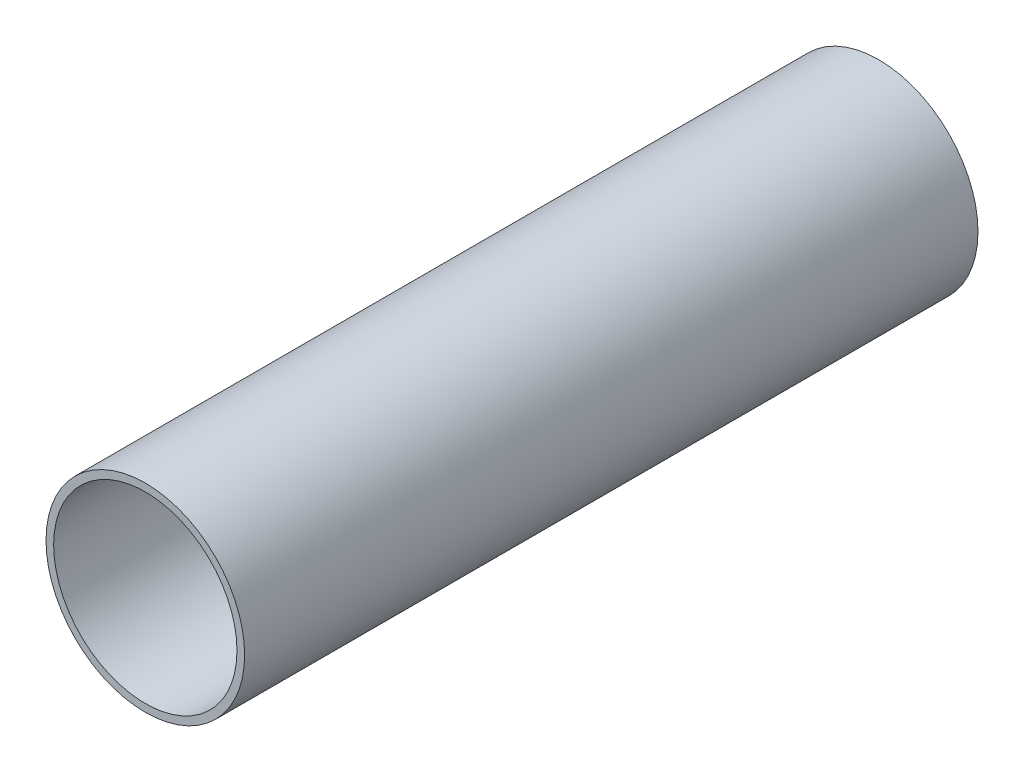
ISO-10303-21;
HEADER;
FILE_DESCRIPTION(('STEP AP214'),'2;1');
FILE_NAME('part.step','',(''),(''),'','','');
FILE_SCHEMA(('AUTOMOTIVE_DESIGN { 1 0 10303 214 1 1 1 1 }'));
ENDSEC;
DATA;
#1=APPLICATION_CONTEXT('core data for automotive mechanical design processes');
#2=APPLICATION_PROTOCOL_DEFINITION('international standard','automotive_design',2000,#1);
#3=PRODUCT_CONTEXT('',#1,'mechanical');
#4=PRODUCT('Part','Part','',(#3));
#5=PRODUCT_RELATED_PRODUCT_CATEGORY('part','',(#4));
#6=PRODUCT_DEFINITION_FORMATION('','',#4);
#7=PRODUCT_DEFINITION_CONTEXT('part definition',#1,'design');
#8=PRODUCT_DEFINITION('design','',#6,#7);
#9=PRODUCT_DEFINITION_SHAPE('','',#8);
#10=(LENGTH_UNIT() NAMED_UNIT(*) SI_UNIT(.MILLI.,.METRE.));
#11=(NAMED_UNIT(*) PLANE_ANGLE_UNIT() SI_UNIT($,.RADIAN.));
#12=(NAMED_UNIT(*) SI_UNIT($,.STERADIAN.) SOLID_ANGLE_UNIT());
#13=UNCERTAINTY_MEASURE_WITH_UNIT(LENGTH_MEASURE(1.E-05),#10,'distance_accuracy_value','');
#14=(GEOMETRIC_REPRESENTATION_CONTEXT(3) GLOBAL_UNCERTAINTY_ASSIGNED_CONTEXT((#13)) GLOBAL_UNIT_ASSIGNED_CONTEXT((#10,
#11,#12)) REPRESENTATION_CONTEXT('',''));
#15=CARTESIAN_POINT('',(0.,0.,0.));
#16=DIRECTION('',(0.,0.,1.));
#17=DIRECTION('',(1.,0.,0.));
#18=AXIS2_PLACEMENT_3D('',#15,#16,#17);
#19=CARTESIAN_POINT('',(0.,0.,304.8));
#20=DIRECTION('',(0.,0.,1.));
#21=DIRECTION('',(1.,0.,0.));
#22=AXIS2_PLACEMENT_3D('',#19,#20,#21);
#23=PLANE('',#22);
#24=CARTESIAN_POINT('',(0.,0.,304.8));
#25=DIRECTION('',(0.,0.,1.));
#26=DIRECTION('',(1.,0.,0.));
#27=AXIS2_PLACEMENT_3D('',#24,#25,#26);
#28=CIRCLE('',#27,41.275);
#29=CARTESIAN_POINT('',(-41.275,0.,304.8));
#30=VERTEX_POINT('',#29);
#31=EDGE_CURVE('E10',#30,#30,#28,.T.);
#32=ORIENTED_EDGE('',*,*,#31,.T.);
#33=EDGE_LOOP('',(#32));
#34=FACE_BOUND('',#33,.T.);
#35=CARTESIAN_POINT('',(0.,0.,304.8));
#36=DIRECTION('',(0.,0.,1.));
#37=DIRECTION('',(1.,0.,0.));
#38=AXIS2_PLACEMENT_3D('',#35,#36,#37);
#39=CIRCLE('',#38,38.1);
#40=CARTESIAN_POINT('',(-38.1,0.,304.8));
#41=VERTEX_POINT('',#40);
#42=EDGE_CURVE('E56',#41,#41,#39,.T.);
#43=ORIENTED_EDGE('',*,*,#42,.F.);
#44=EDGE_LOOP('',(#43));
#45=FACE_BOUND('',#44,.T.);
#46=ADVANCED_FACE('F43',(#34,#45),#23,.T.);
#47=CARTESIAN_POINT('',(0.,0.,0.));
#48=DIRECTION('',(0.,0.,1.));
#49=DIRECTION('',(1.,0.,0.));
#50=AXIS2_PLACEMENT_3D('',#47,#48,#49);
#51=PLANE('',#50);
#52=CARTESIAN_POINT('',(0.,0.,0.));
#53=DIRECTION('',(0.,0.,1.));
#54=DIRECTION('',(1.,0.,0.));
#55=AXIS2_PLACEMENT_3D('',#52,#53,#54);
#56=CIRCLE('',#55,41.275);
#57=CARTESIAN_POINT('',(-41.275,0.,0.));
#58=VERTEX_POINT('',#57);
#59=EDGE_CURVE('E47',#58,#58,#56,.T.);
#60=ORIENTED_EDGE('',*,*,#59,.F.);
#61=EDGE_LOOP('',(#60));
#62=FACE_BOUND('',#61,.T.);
#63=CARTESIAN_POINT('',(0.,0.,0.));
#64=DIRECTION('',(0.,0.,1.));
#65=DIRECTION('',(1.,0.,0.));
#66=AXIS2_PLACEMENT_3D('',#63,#64,#65);
#67=CIRCLE('',#66,38.1);
#68=CARTESIAN_POINT('',(-38.1,0.,0.));
#69=VERTEX_POINT('',#68);
#70=EDGE_CURVE('E58',#69,#69,#67,.T.);
#71=ORIENTED_EDGE('',*,*,#70,.T.);
#72=EDGE_LOOP('',(#71));
#73=FACE_BOUND('',#72,.T.);
#74=ADVANCED_FACE('F70',(#62,#73),#51,.F.);
#75=CARTESIAN_POINT('',(0.,0.,304.8));
#76=DIRECTION('',(0.,0.,-1.));
#77=DIRECTION('',(-1.,0.,0.));
#78=AXIS2_PLACEMENT_3D('',#75,#76,#77);
#79=CYLINDRICAL_SURFACE('',#78,41.275);
#80=CARTESIAN_POINT('',(-41.275,0.,304.8));
#81=CARTESIAN_POINT('',(-41.275,0.,301.625));
#82=CARTESIAN_POINT('',(-41.275,0.,298.45));
#83=CARTESIAN_POINT('',(-41.275,0.,292.1));
#84=CARTESIAN_POINT('',(-41.275,0.,288.925));
#85=CARTESIAN_POINT('',(-41.275,0.,282.575));
#86=CARTESIAN_POINT('',(-41.275,0.,279.4));
#87=CARTESIAN_POINT('',(-41.275,0.,273.05));
#88=CARTESIAN_POINT('',(-41.275,0.,269.875));
#89=CARTESIAN_POINT('',(-41.275,0.,263.525));
#90=CARTESIAN_POINT('',(-41.275,0.,260.35));
#91=CARTESIAN_POINT('',(-41.275,0.,254.));
#92=CARTESIAN_POINT('',(-41.275,0.,250.825));
#93=CARTESIAN_POINT('',(-41.275,0.,244.475));
#94=CARTESIAN_POINT('',(-41.275,0.,241.3));
#95=CARTESIAN_POINT('',(-41.275,0.,234.95));
#96=CARTESIAN_POINT('',(-41.275,0.,231.775));
#97=CARTESIAN_POINT('',(-41.275,0.,225.425));
#98=CARTESIAN_POINT('',(-41.275,0.,222.25));
#99=CARTESIAN_POINT('',(-41.275,0.,215.9));
#100=CARTESIAN_POINT('',(-41.275,0.,212.725));
#101=CARTESIAN_POINT('',(-41.275,0.,206.375));
#102=CARTESIAN_POINT('',(-41.275,0.,203.2));
#103=CARTESIAN_POINT('',(-41.275,0.,196.85));
#104=CARTESIAN_POINT('',(-41.275,0.,193.675));
#105=CARTESIAN_POINT('',(-41.275,0.,187.325));
#106=CARTESIAN_POINT('',(-41.275,0.,184.15));
#107=CARTESIAN_POINT('',(-41.275,0.,177.8));
#108=CARTESIAN_POINT('',(-41.275,0.,174.625));
#109=CARTESIAN_POINT('',(-41.275,0.,168.275));
#110=CARTESIAN_POINT('',(-41.275,0.,165.1));
#111=CARTESIAN_POINT('',(-41.275,0.,158.75));
#112=CARTESIAN_POINT('',(-41.275,0.,155.575));
#113=CARTESIAN_POINT('',(-41.275,0.,149.225));
#114=CARTESIAN_POINT('',(-41.275,0.,146.05));
#115=CARTESIAN_POINT('',(-41.275,0.,139.7));
#116=CARTESIAN_POINT('',(-41.275,0.,136.525));
#117=CARTESIAN_POINT('',(-41.275,0.,130.175));
#118=CARTESIAN_POINT('',(-41.275,0.,127.));
#119=CARTESIAN_POINT('',(-41.275,0.,120.65));
#120=CARTESIAN_POINT('',(-41.275,0.,117.475));
#121=CARTESIAN_POINT('',(-41.275,0.,111.125));
#122=CARTESIAN_POINT('',(-41.275,0.,107.95));
#123=CARTESIAN_POINT('',(-41.275,0.,101.6));
#124=CARTESIAN_POINT('',(-41.275,0.,98.425));
#125=CARTESIAN_POINT('',(-41.275,0.,92.075));
#126=CARTESIAN_POINT('',(-41.275,0.,88.9));
#127=CARTESIAN_POINT('',(-41.275,0.,82.55));
#128=CARTESIAN_POINT('',(-41.275,0.,79.375));
#129=CARTESIAN_POINT('',(-41.275,0.,73.025));
#130=CARTESIAN_POINT('',(-41.275,0.,69.85));
#131=CARTESIAN_POINT('',(-41.275,0.,63.5));
#132=CARTESIAN_POINT('',(-41.275,0.,60.325));
#133=CARTESIAN_POINT('',(-41.275,0.,53.975));
#134=CARTESIAN_POINT('',(-41.275,0.,50.8));
#135=CARTESIAN_POINT('',(-41.275,0.,44.45));
#136=CARTESIAN_POINT('',(-41.275,0.,41.275));
#137=CARTESIAN_POINT('',(-41.275,0.,34.925));
#138=CARTESIAN_POINT('',(-41.275,0.,31.75));
#139=CARTESIAN_POINT('',(-41.275,0.,25.4));
#140=CARTESIAN_POINT('',(-41.275,0.,22.225));
#141=CARTESIAN_POINT('',(-41.275,0.,15.875));
#142=CARTESIAN_POINT('',(-41.275,0.,12.7));
#143=CARTESIAN_POINT('',(-41.275,0.,6.35));
#144=CARTESIAN_POINT('',(-41.275,0.,3.175));
#145=CARTESIAN_POINT('',(-41.275,0.,0.));
#146=B_SPLINE_CURVE_WITH_KNOTS('',3,(#80,#81,#82,#83,#84,#85,#86,#87,#88,#89,#90,#91,#92,#93,
#94,#95,#96,#97,#98,#99,#100,#101,#102,#103,#104,#105,#106,#107,#108,#109,#110,#111,#112,#113,
#114,#115,#116,#117,#118,#119,#120,#121,#122,#123,#124,#125,#126,#127,#128,#129,#130,#131,#132,
#133,#134,#135,#136,#137,#138,#139,#140,#141,#142,#143,#144,#145),.UNSPECIFIED.,.F.,.F.,(4,2,2,
2,2,2,2,2,2,2,2,2,2,2,2,2,2,2,2,2,2,2,2,2,2,2,2,2,2,2,2,2,4),(0.,9.52500000000001,19.05,28.575,
38.1,47.625,57.15,66.675,76.2,85.7250000000001,95.2500000000001,104.775,114.3,123.825,133.35,
142.875,152.4,161.925,171.45,180.975,190.5,200.025,209.55,219.075,228.6,238.125,247.65,257.175,
266.7,276.225,285.75,295.275,304.8),.UNSPECIFIED.);
#147=EDGE_CURVE('BSEAM45',#30,#58,#146,.T.);
#148=ORIENTED_EDGE('',*,*,#31,.F.);
#149=ORIENTED_EDGE('',*,*,#59,.T.);
#150=ORIENTED_EDGE('',*,*,#147,.T.);
#151=ORIENTED_EDGE('',*,*,#147,.F.);
#152=EDGE_LOOP('',(#148,#150,#149,#151));
#153=FACE_BOUND('',#152,.T.);
#154=ADVANCED_FACE('F45',(#153),#79,.T.);
#155=CARTESIAN_POINT('',(0.,0.,304.8));
#156=DIRECTION('',(0.,0.,-1.));
#157=DIRECTION('',(-1.,0.,0.));
#158=AXIS2_PLACEMENT_3D('',#155,#156,#157);
#159=CYLINDRICAL_SURFACE('',#158,38.1);
#160=CARTESIAN_POINT('',(-38.1,0.,304.8));
#161=CARTESIAN_POINT('',(-38.1,0.,301.625));
#162=CARTESIAN_POINT('',(-38.1,0.,298.45));
#163=CARTESIAN_POINT('',(-38.1,0.,292.1));
#164=CARTESIAN_POINT('',(-38.1,0.,288.925));
#165=CARTESIAN_POINT('',(-38.1,0.,282.575));
#166=CARTESIAN_POINT('',(-38.1,0.,279.4));
#167=CARTESIAN_POINT('',(-38.1,0.,273.05));
#168=CARTESIAN_POINT('',(-38.1,0.,269.875));
#169=CARTESIAN_POINT('',(-38.1,0.,263.525));
#170=CARTESIAN_POINT('',(-38.1,0.,260.35));
#171=CARTESIAN_POINT('',(-38.1,0.,254.));
#172=CARTESIAN_POINT('',(-38.1,0.,250.825));
#173=CARTESIAN_POINT('',(-38.1,0.,244.475));
#174=CARTESIAN_POINT('',(-38.1,0.,241.3));
#175=CARTESIAN_POINT('',(-38.1,0.,234.95));
#176=CARTESIAN_POINT('',(-38.1,0.,231.775));
#177=CARTESIAN_POINT('',(-38.1,0.,225.425));
#178=CARTESIAN_POINT('',(-38.1,0.,222.25));
#179=CARTESIAN_POINT('',(-38.1,0.,215.9));
#180=CARTESIAN_POINT('',(-38.1,0.,212.725));
#181=CARTESIAN_POINT('',(-38.1,0.,206.375));
#182=CARTESIAN_POINT('',(-38.1,0.,203.2));
#183=CARTESIAN_POINT('',(-38.1,0.,196.85));
#184=CARTESIAN_POINT('',(-38.1,0.,193.675));
#185=CARTESIAN_POINT('',(-38.1,0.,187.325));
#186=CARTESIAN_POINT('',(-38.1,0.,184.15));
#187=CARTESIAN_POINT('',(-38.1,0.,177.8));
#188=CARTESIAN_POINT('',(-38.1,0.,174.625));
#189=CARTESIAN_POINT('',(-38.1,0.,168.275));
#190=CARTESIAN_POINT('',(-38.1,0.,165.1));
#191=CARTESIAN_POINT('',(-38.1,0.,158.75));
#192=CARTESIAN_POINT('',(-38.1,0.,155.575));
#193=CARTESIAN_POINT('',(-38.1,0.,149.225));
#194=CARTESIAN_POINT('',(-38.1,0.,146.05));
#195=CARTESIAN_POINT('',(-38.1,0.,139.7));
#196=CARTESIAN_POINT('',(-38.1,0.,136.525));
#197=CARTESIAN_POINT('',(-38.1,0.,130.175));
#198=CARTESIAN_POINT('',(-38.1,0.,127.));
#199=CARTESIAN_POINT('',(-38.1,0.,120.65));
#200=CARTESIAN_POINT('',(-38.1,0.,117.475));
#201=CARTESIAN_POINT('',(-38.1,0.,111.125));
#202=CARTESIAN_POINT('',(-38.1,0.,107.95));
#203=CARTESIAN_POINT('',(-38.1,0.,101.6));
#204=CARTESIAN_POINT('',(-38.1,0.,98.425));
#205=CARTESIAN_POINT('',(-38.1,0.,92.075));
#206=CARTESIAN_POINT('',(-38.1,0.,88.9));
#207=CARTESIAN_POINT('',(-38.1,0.,82.55));
#208=CARTESIAN_POINT('',(-38.1,0.,79.375));
#209=CARTESIAN_POINT('',(-38.1,0.,73.025));
#210=CARTESIAN_POINT('',(-38.1,0.,69.85));
#211=CARTESIAN_POINT('',(-38.1,0.,63.5));
#212=CARTESIAN_POINT('',(-38.1,0.,60.325));
#213=CARTESIAN_POINT('',(-38.1,0.,53.975));
#214=CARTESIAN_POINT('',(-38.1,0.,50.8));
#215=CARTESIAN_POINT('',(-38.1,0.,44.45));
#216=CARTESIAN_POINT('',(-38.1,0.,41.275));
#217=CARTESIAN_POINT('',(-38.1,0.,34.925));
#218=CARTESIAN_POINT('',(-38.1,0.,31.75));
#219=CARTESIAN_POINT('',(-38.1,0.,25.4));
#220=CARTESIAN_POINT('',(-38.1,0.,22.225));
#221=CARTESIAN_POINT('',(-38.1,0.,15.875));
#222=CARTESIAN_POINT('',(-38.1,0.,12.7));
#223=CARTESIAN_POINT('',(-38.1,0.,6.35));
#224=CARTESIAN_POINT('',(-38.1,0.,3.175));
#225=CARTESIAN_POINT('',(-38.1,0.,0.));
#226=B_SPLINE_CURVE_WITH_KNOTS('',3,(#160,#161,#162,#163,#164,#165,#166,#167,#168,#169,#170,
#171,#172,#173,#174,#175,#176,#177,#178,#179,#180,#181,#182,#183,#184,#185,#186,#187,#188,#189,
#190,#191,#192,#193,#194,#195,#196,#197,#198,#199,#200,#201,#202,#203,#204,#205,#206,#207,#208,
#209,#210,#211,#212,#213,#214,#215,#216,#217,#218,#219,#220,#221,#222,#223,#224,#225),
.UNSPECIFIED.,.F.,.F.,(4,2,2,2,2,2,2,2,2,2,2,2,2,2,2,2,2,2,2,2,2,2,2,2,2,2,2,2,2,2,2,2,4),(0.,
9.52500000000001,19.05,28.575,38.1,47.625,57.15,66.675,76.2,85.7250000000001,95.2500000000001,
104.775,114.3,123.825,133.35,142.875,152.4,161.925,171.45,180.975,190.5,200.025,209.55,219.075,
228.6,238.125,247.65,257.175,266.7,276.225,285.75,295.275,304.8),.UNSPECIFIED.);
#227=EDGE_CURVE('BSEAM66',#41,#69,#226,.T.);
#228=ORIENTED_EDGE('',*,*,#42,.T.);
#229=ORIENTED_EDGE('',*,*,#70,.F.);
#230=ORIENTED_EDGE('',*,*,#227,.T.);
#231=ORIENTED_EDGE('',*,*,#227,.F.);
#232=EDGE_LOOP('',(#228,#230,#229,#231));
#233=FACE_BOUND('',#232,.T.);
#234=ADVANCED_FACE('F66',(#233),#159,.F.);
#235=CLOSED_SHELL('',(#46,#74,#154,#234));
#236=MANIFOLD_SOLID_BREP('B2',#235);
#237=ADVANCED_BREP_SHAPE_REPRESENTATION('',(#18,#236),#14);
#238=SHAPE_DEFINITION_REPRESENTATION(#9,#237);
ENDSEC;
END-ISO-10303-21;
